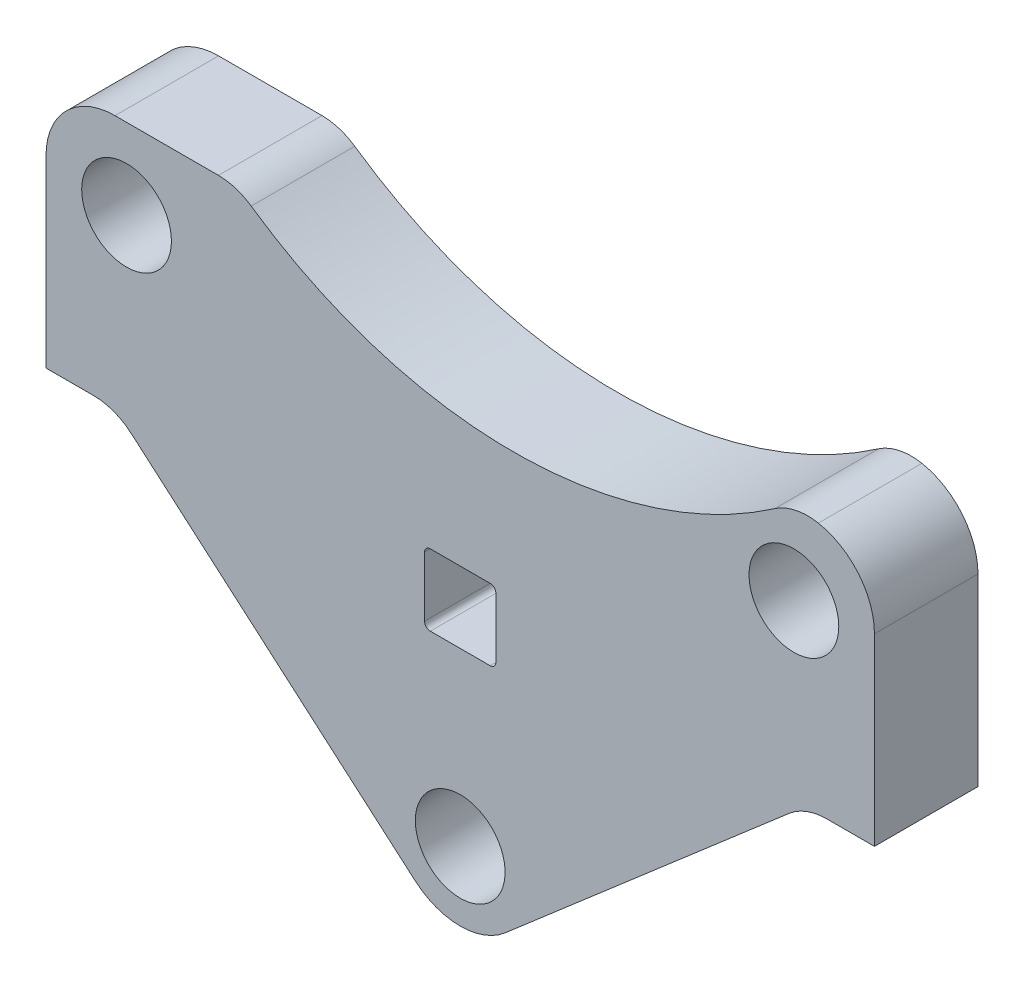
ISO-10303-21;
HEADER;
FILE_DESCRIPTION(('STEP AP214'),'2;1');
FILE_NAME('part.step','',(''),(''),'','','');
FILE_SCHEMA(('AUTOMOTIVE_DESIGN { 1 0 10303 214 1 1 1 1 }'));
ENDSEC;
DATA;
#1=APPLICATION_CONTEXT('core data for automotive mechanical design processes');
#2=APPLICATION_PROTOCOL_DEFINITION('international standard','automotive_design',2000,#1);
#3=PRODUCT_CONTEXT('',#1,'mechanical');
#4=PRODUCT('Part','Part','',(#3));
#5=PRODUCT_RELATED_PRODUCT_CATEGORY('part','',(#4));
#6=PRODUCT_DEFINITION_FORMATION('','',#4);
#7=PRODUCT_DEFINITION_CONTEXT('part definition',#1,'design');
#8=PRODUCT_DEFINITION('design','',#6,#7);
#9=PRODUCT_DEFINITION_SHAPE('','',#8);
#10=(LENGTH_UNIT() NAMED_UNIT(*) SI_UNIT(.MILLI.,.METRE.));
#11=(NAMED_UNIT(*) PLANE_ANGLE_UNIT() SI_UNIT($,.RADIAN.));
#12=(NAMED_UNIT(*) SI_UNIT($,.STERADIAN.) SOLID_ANGLE_UNIT());
#13=UNCERTAINTY_MEASURE_WITH_UNIT(LENGTH_MEASURE(1.E-05),#10,'distance_accuracy_value','');
#14=(GEOMETRIC_REPRESENTATION_CONTEXT(3) GLOBAL_UNCERTAINTY_ASSIGNED_CONTEXT((#13)) GLOBAL_UNIT_ASSIGNED_CONTEXT((#10,
#11,#12)) REPRESENTATION_CONTEXT('',''));
#15=CARTESIAN_POINT('',(0.,0.,0.));
#16=DIRECTION('',(0.,0.,1.));
#17=DIRECTION('',(1.,0.,0.));
#18=AXIS2_PLACEMENT_3D('',#15,#16,#17);
#19=CARTESIAN_POINT('',(29.,-17.,54.000025));
#20=DIRECTION('',(0.,0.,-1.));
#21=DIRECTION('',(-1.,0.,0.));
#22=AXIS2_PLACEMENT_3D('',#19,#20,#21);
#23=CYLINDRICAL_SURFACE('',#22,3.9);
#24=CARTESIAN_POINT('',(29.,-17.,14.));
#25=DIRECTION('',(0.,0.,1.));
#26=DIRECTION('',(1.,0.,0.));
#27=AXIS2_PLACEMENT_3D('',#24,#25,#26);
#28=CIRCLE('',#27,3.9);
#29=CARTESIAN_POINT('',(32.9,-17.,14.));
#30=VERTEX_POINT('',#29);
#31=EDGE_CURVE('E352',#30,#30,#28,.T.);
#32=ORIENTED_EDGE('',*,*,#31,.T.);
#33=EDGE_LOOP('',(#32));
#34=FACE_BOUND('',#33,.T.);
#35=CARTESIAN_POINT('',(29.,-17.,5.));
#36=DIRECTION('',(0.,0.,-1.));
#37=DIRECTION('',(-1.,0.,0.));
#38=AXIS2_PLACEMENT_3D('',#35,#36,#37);
#39=CIRCLE('',#38,3.9);
#40=CARTESIAN_POINT('',(25.1,-17.,5.));
#41=VERTEX_POINT('',#40);
#42=EDGE_CURVE('E349',#41,#41,#39,.T.);
#43=ORIENTED_EDGE('',*,*,#42,.T.);
#44=EDGE_LOOP('',(#43));
#45=FACE_BOUND('',#44,.T.);
#46=ADVANCED_FACE('F35',(#34,#45),#23,.F.);
#47=CARTESIAN_POINT('',(-29.,-17.,54.000025));
#48=DIRECTION('',(0.,0.,-1.));
#49=DIRECTION('',(-1.,0.,0.));
#50=AXIS2_PLACEMENT_3D('',#47,#48,#49);
#51=CYLINDRICAL_SURFACE('',#50,3.89999999999999);
#52=CARTESIAN_POINT('',(-29.,-17.,14.));
#53=DIRECTION('',(0.,0.,1.));
#54=DIRECTION('',(1.,0.,0.));
#55=AXIS2_PLACEMENT_3D('',#52,#53,#54);
#56=CIRCLE('',#55,3.89999999999999);
#57=CARTESIAN_POINT('',(-25.1,-17.,14.));
#58=VERTEX_POINT('',#57);
#59=EDGE_CURVE('E344',#58,#58,#56,.T.);
#60=ORIENTED_EDGE('',*,*,#59,.T.);
#61=EDGE_LOOP('',(#60));
#62=FACE_BOUND('',#61,.T.);
#63=CARTESIAN_POINT('',(-29.,-17.,5.));
#64=DIRECTION('',(0.,0.,-1.));
#65=DIRECTION('',(-1.,0.,0.));
#66=AXIS2_PLACEMENT_3D('',#63,#64,#65);
#67=CIRCLE('',#66,3.89999999999999);
#68=CARTESIAN_POINT('',(-32.9,-17.,5.));
#69=VERTEX_POINT('',#68);
#70=EDGE_CURVE('E341',#69,#69,#67,.T.);
#71=ORIENTED_EDGE('',*,*,#70,.T.);
#72=EDGE_LOOP('',(#71));
#73=FACE_BOUND('',#72,.T.);
#74=ADVANCED_FACE('F473',(#62,#73),#51,.F.);
#75=CARTESIAN_POINT('',(30.,-16.,14.));
#76=DIRECTION('',(0.,0.,-1.));
#77=DIRECTION('',(-1.,0.,0.));
#78=AXIS2_PLACEMENT_3D('',#75,#76,#77);
#79=CYLINDRICAL_SURFACE('',#78,6.);
#80=CARTESIAN_POINT('',(30.,-16.,5.));
#81=DIRECTION('',(0.,0.,-1.));
#82=DIRECTION('',(1.,0.,0.));
#83=AXIS2_PLACEMENT_3D('',#80,#81,#82);
#84=CIRCLE('',#83,6.);
#85=CARTESIAN_POINT('',(31.1219773338338,-10.1058362032971,5.));
#86=VERTEX_POINT('',#85);
#87=CARTESIAN_POINT('',(36.,-16.,5.));
#88=VERTEX_POINT('',#87);
#89=EDGE_CURVE('E198',#86,#88,#84,.T.);
#90=ORIENTED_EDGE('',*,*,#89,.F.);
#91=DIRECTION('',(0.,0.,-1.));
#92=VECTOR('',#91,1.);
#93=CARTESIAN_POINT('',(31.1219773338338,-10.1058362032971,14.));
#94=LINE('',#93,#92);
#95=CARTESIAN_POINT('',(31.1219773338338,-10.1058362032971,14.));
#96=VERTEX_POINT('',#95);
#97=EDGE_CURVE('E254',#86,#96,#94,.F.);
#98=ORIENTED_EDGE('',*,*,#97,.T.);
#99=CARTESIAN_POINT('',(30.,-16.,14.));
#100=DIRECTION('',(0.,0.,-1.));
#101=DIRECTION('',(1.,0.,0.));
#102=AXIS2_PLACEMENT_3D('',#99,#100,#101);
#103=CIRCLE('',#102,6.);
#104=CARTESIAN_POINT('',(36.,-16.,14.));
#105=VERTEX_POINT('',#104);
#106=EDGE_CURVE('E377',#96,#105,#103,.T.);
#107=ORIENTED_EDGE('',*,*,#106,.T.);
#108=DIRECTION('',(0.,0.,-1.));
#109=VECTOR('',#108,1.);
#110=CARTESIAN_POINT('',(36.,-16.,14.));
#111=LINE('',#110,#109);
#112=EDGE_CURVE('E386',#105,#88,#111,.T.);
#113=ORIENTED_EDGE('',*,*,#112,.T.);
#114=EDGE_LOOP('',(#90,#98,#107,#113));
#115=FACE_BOUND('',#114,.T.);
#116=ADVANCED_FACE('F425',(#115),#79,.T.);
#117=CARTESIAN_POINT('',(-30.,-16.,14.));
#118=DIRECTION('',(0.,0.,-1.));
#119=DIRECTION('',(-1.,0.,0.));
#120=AXIS2_PLACEMENT_3D('',#117,#118,#119);
#121=CYLINDRICAL_SURFACE('',#120,6.);
#122=CARTESIAN_POINT('',(-30.,-16.,5.));
#123=DIRECTION('',(0.,0.,-1.));
#124=DIRECTION('',(1.,0.,0.));
#125=AXIS2_PLACEMENT_3D('',#122,#123,#124);
#126=CIRCLE('',#125,6.);
#127=CARTESIAN_POINT('',(-36.,-16.,5.));
#128=VERTEX_POINT('',#127);
#129=CARTESIAN_POINT('',(-30.,-10.,5.));
#130=VERTEX_POINT('',#129);
#131=EDGE_CURVE('E202',#128,#130,#126,.T.);
#132=ORIENTED_EDGE('',*,*,#131,.F.);
#133=DIRECTION('',(0.,0.,-1.));
#134=VECTOR('',#133,1.);
#135=CARTESIAN_POINT('',(-36.,-16.,14.));
#136=LINE('',#135,#134);
#137=CARTESIAN_POINT('',(-36.,-16.,14.));
#138=VERTEX_POINT('',#137);
#139=EDGE_CURVE('E379',#138,#128,#136,.T.);
#140=ORIENTED_EDGE('',*,*,#139,.F.);
#141=CARTESIAN_POINT('',(-30.,-16.,14.));
#142=DIRECTION('',(0.,0.,-1.));
#143=DIRECTION('',(1.,0.,0.));
#144=AXIS2_PLACEMENT_3D('',#141,#142,#143);
#145=CIRCLE('',#144,6.);
#146=CARTESIAN_POINT('',(-30.,-10.,14.));
#147=VERTEX_POINT('',#146);
#148=EDGE_CURVE('E370',#138,#147,#145,.T.);
#149=ORIENTED_EDGE('',*,*,#148,.T.);
#150=DIRECTION('',(0.,0.,-1.));
#151=VECTOR('',#150,1.);
#152=CARTESIAN_POINT('',(-30.,-10.,14.));
#153=LINE('',#152,#151);
#154=EDGE_CURVE('E389',#147,#130,#153,.T.);
#155=ORIENTED_EDGE('',*,*,#154,.T.);
#156=EDGE_LOOP('',(#132,#140,#149,#155));
#157=FACE_BOUND('',#156,.T.);
#158=ADVANCED_FACE('F404',(#157),#121,.T.);
#159=CARTESIAN_POINT('',(30.,-10.,14.));
#160=DIRECTION('',(0.,1.,0.));
#161=DIRECTION('',(0.,0.,1.));
#162=AXIS2_PLACEMENT_3D('',#159,#160,#161);
#163=PLANE('',#162);
#164=DIRECTION('',(1.,0.,0.));
#165=VECTOR('',#164,1.);
#166=CARTESIAN_POINT('',(30.,-10.,14.));
#167=LINE('',#166,#165);
#168=CARTESIAN_POINT('',(-21.0124969497011,-10.,14.));
#169=VERTEX_POINT('',#168);
#170=EDGE_CURVE('E373',#147,#169,#167,.T.);
#171=ORIENTED_EDGE('',*,*,#170,.T.);
#172=DIRECTION('',(0.,0.,1.));
#173=VECTOR('',#172,1.);
#174=CARTESIAN_POINT('',(-21.0124969497011,-10.,5.));
#175=LINE('',#174,#173);
#176=CARTESIAN_POINT('',(-21.0124969497011,-10.,5.));
#177=VERTEX_POINT('',#176);
#178=EDGE_CURVE('E260',#169,#177,#175,.F.);
#179=ORIENTED_EDGE('',*,*,#178,.T.);
#180=DIRECTION('',(1.,0.,0.));
#181=VECTOR('',#180,1.);
#182=CARTESIAN_POINT('',(30.,-10.,5.));
#183=LINE('',#182,#181);
#184=EDGE_CURVE('E382',#130,#177,#183,.T.);
#185=ORIENTED_EDGE('',*,*,#184,.F.);
#186=ORIENTED_EDGE('',*,*,#154,.F.);
#187=EDGE_LOOP('',(#171,#179,#185,#186));
#188=FACE_BOUND('',#187,.T.);
#189=ADVANCED_FACE('F408',(#188),#163,.T.);
#190=CARTESIAN_POINT('',(4.60000000003025,22.,54.000025));
#191=DIRECTION('',(0.,0.,-1.));
#192=DIRECTION('',(-1.,0.,0.));
#193=AXIS2_PLACEMENT_3D('',#190,#191,#192);
#194=CYLINDRICAL_SURFACE('',#193,40.);
#195=CARTESIAN_POINT('',(4.60000000003025,22.,14.));
#196=DIRECTION('',(0.,0.,1.));
#197=DIRECTION('',(1.,0.,0.));
#198=AXIS2_PLACEMENT_3D('',#195,#196,#197);
#199=CIRCLE('',#198,40.);
#200=CARTESIAN_POINT('',(-18.1666639552865,-10.8888888888889,14.));
#201=VERTEX_POINT('',#200);
#202=CARTESIAN_POINT('',(27.3439966420528,-10.9045683264143,14.));
#203=VERTEX_POINT('',#202);
#204=EDGE_CURVE('E220',#201,#203,#199,.T.);
#205=ORIENTED_EDGE('',*,*,#204,.T.);
#206=DIRECTION('',(0.,0.,-1.));
#207=VECTOR('',#206,1.);
#208=CARTESIAN_POINT('',(27.3439966420528,-10.9045683264143,54.000025));
#209=LINE('',#208,#207);
#210=CARTESIAN_POINT('',(27.3439966420528,-10.9045683264143,5.));
#211=VERTEX_POINT('',#210);
#212=EDGE_CURVE('E247',#203,#211,#209,.T.);
#213=ORIENTED_EDGE('',*,*,#212,.T.);
#214=CARTESIAN_POINT('',(4.60000000003025,22.,5.));
#215=DIRECTION('',(0.,0.,-1.));
#216=DIRECTION('',(-1.,0.,0.));
#217=AXIS2_PLACEMENT_3D('',#214,#215,#216);
#218=CIRCLE('',#217,40.);
#219=CARTESIAN_POINT('',(-18.1666639552865,-10.8888888888889,5.));
#220=VERTEX_POINT('',#219);
#221=EDGE_CURVE('E338',#211,#220,#218,.T.);
#222=ORIENTED_EDGE('',*,*,#221,.T.);
#223=DIRECTION('',(0.,0.,-1.));
#224=VECTOR('',#223,1.);
#225=CARTESIAN_POINT('',(-18.1666639552865,-10.8888888888889,54.000025));
#226=LINE('',#225,#224);
#227=EDGE_CURVE('E244',#220,#201,#226,.F.);
#228=ORIENTED_EDGE('',*,*,#227,.T.);
#229=EDGE_LOOP('',(#205,#213,#222,#228));
#230=FACE_BOUND('',#229,.T.);
#231=ADVANCED_FACE('F416',(#230),#194,.F.);
#232=CARTESIAN_POINT('',(0.,-50.,14.));
#233=DIRECTION('',(0.,0.,-1.));
#234=DIRECTION('',(-1.,0.,0.));
#235=AXIS2_PLACEMENT_3D('',#232,#233,#234);
#236=CYLINDRICAL_SURFACE('',#235,6.);
#237=CARTESIAN_POINT('',(0.,-50.,5.));
#238=DIRECTION('',(0.,0.,-1.));
#239=DIRECTION('',(-1.,0.,0.));
#240=AXIS2_PLACEMENT_3D('',#237,#238,#239);
#241=CIRCLE('',#240,6.);
#242=CARTESIAN_POINT('',(3.92359198934366,-54.5393199822394,5.));
#243=VERTEX_POINT('',#242);
#244=CARTESIAN_POINT('',(-3.92359198934366,-54.5393199822394,5.));
#245=VERTEX_POINT('',#244);
#246=EDGE_CURVE('E363',#243,#245,#241,.T.);
#247=ORIENTED_EDGE('',*,*,#246,.F.);
#248=DIRECTION('',(0.,0.,-1.));
#249=VECTOR('',#248,1.);
#250=CARTESIAN_POINT('',(3.92359198934366,-54.5393199822394,14.));
#251=LINE('',#250,#249);
#252=CARTESIAN_POINT('',(3.92359198934366,-54.5393199822394,14.));
#253=VERTEX_POINT('',#252);
#254=EDGE_CURVE('E362',#253,#243,#251,.T.);
#255=ORIENTED_EDGE('',*,*,#254,.F.);
#256=CARTESIAN_POINT('',(0.,-50.,14.));
#257=DIRECTION('',(0.,0.,-1.));
#258=DIRECTION('',(-1.,0.,0.));
#259=AXIS2_PLACEMENT_3D('',#256,#257,#258);
#260=CIRCLE('',#259,6.);
#261=CARTESIAN_POINT('',(-3.92359198934366,-54.5393199822394,14.));
#262=VERTEX_POINT('',#261);
#263=EDGE_CURVE('E355',#253,#262,#260,.T.);
#264=ORIENTED_EDGE('',*,*,#263,.T.);
#265=DIRECTION('',(0.,0.,-1.));
#266=VECTOR('',#265,1.);
#267=CARTESIAN_POINT('',(-3.92359198934366,-54.5393199822394,14.));
#268=LINE('',#267,#266);
#269=EDGE_CURVE('E203',#262,#245,#268,.T.);
#270=ORIENTED_EDGE('',*,*,#269,.T.);
#271=EDGE_LOOP('',(#247,#255,#264,#270));
#272=FACE_BOUND('',#271,.T.);
#273=ADVANCED_FACE('F454',(#272),#236,.T.);
#274=CARTESIAN_POINT('',(-30.,-32.,14.));
#275=DIRECTION('',(-0.653931998223944,-0.756553330373239,0.));
#276=DIRECTION('',(0.75655333037324,-0.653931998223944,0.));
#277=AXIS2_PLACEMENT_3D('',#274,#275,#276);
#278=PLANE('',#277);
#279=DIRECTION('',(-0.756553330373239,0.653931998223944,0.));
#280=VECTOR('',#279,1.);
#281=CARTESIAN_POINT('',(-30.,-32.,14.));
#282=LINE('',#281,#280);
#283=CARTESIAN_POINT('',(-28.5917466252254,-33.2172333481338,14.));
#284=VERTEX_POINT('',#283);
#285=EDGE_CURVE('E359',#262,#284,#282,.T.);
#286=ORIENTED_EDGE('',*,*,#285,.T.);
#287=DIRECTION('',(0.,0.,-1.));
#288=VECTOR('',#287,1.);
#289=CARTESIAN_POINT('',(-28.5917466252254,-33.2172333481338,14.));
#290=LINE('',#289,#288);
#291=CARTESIAN_POINT('',(-28.5917466252254,-33.2172333481338,5.));
#292=VERTEX_POINT('',#291);
#293=EDGE_CURVE('E240',#284,#292,#290,.T.);
#294=ORIENTED_EDGE('',*,*,#293,.T.);
#295=DIRECTION('',(-0.756553330373239,0.653931998223944,0.));
#296=VECTOR('',#295,1.);
#297=CARTESIAN_POINT('',(-30.,-32.,5.));
#298=LINE('',#297,#296);
#299=EDGE_CURVE('E356',#245,#292,#298,.T.);
#300=ORIENTED_EDGE('',*,*,#299,.F.);
#301=ORIENTED_EDGE('',*,*,#269,.F.);
#302=EDGE_LOOP('',(#286,#294,#300,#301));
#303=FACE_BOUND('',#302,.T.);
#304=ADVANCED_FACE('F447',(#303),#278,.T.);
#305=CARTESIAN_POINT('',(30.,-32.,14.));
#306=DIRECTION('',(0.653931998223944,-0.756553330373239,0.));
#307=DIRECTION('',(0.75655333037324,0.653931998223944,0.));
#308=AXIS2_PLACEMENT_3D('',#305,#306,#307);
#309=PLANE('',#308);
#310=DIRECTION('',(-0.756553330373239,-0.653931998223944,0.));
#311=VECTOR('',#310,1.);
#312=CARTESIAN_POINT('',(30.,-32.,5.));
#313=LINE('',#312,#311);
#314=CARTESIAN_POINT('',(28.5917466252254,-33.2172333481338,5.));
#315=VERTEX_POINT('',#314);
#316=EDGE_CURVE('E366',#315,#243,#313,.T.);
#317=ORIENTED_EDGE('',*,*,#316,.F.);
#318=DIRECTION('',(0.,0.,-1.));
#319=VECTOR('',#318,1.);
#320=CARTESIAN_POINT('',(28.5917466252254,-33.2172333481338,14.));
#321=LINE('',#320,#319);
#322=CARTESIAN_POINT('',(28.5917466252254,-33.2172333481338,14.));
#323=VERTEX_POINT('',#322);
#324=EDGE_CURVE('E437',#315,#323,#321,.F.);
#325=ORIENTED_EDGE('',*,*,#324,.T.);
#326=DIRECTION('',(-0.756553330373239,-0.653931998223944,0.));
#327=VECTOR('',#326,1.);
#328=CARTESIAN_POINT('',(30.,-32.,14.));
#329=LINE('',#328,#327);
#330=EDGE_CURVE('E353',#323,#253,#329,.T.);
#331=ORIENTED_EDGE('',*,*,#330,.T.);
#332=ORIENTED_EDGE('',*,*,#254,.T.);
#333=EDGE_LOOP('',(#317,#325,#331,#332));
#334=FACE_BOUND('',#333,.T.);
#335=ADVANCED_FACE('F486',(#334),#309,.T.);
#336=CARTESIAN_POINT('',(30.,-16.,14.));
#337=DIRECTION('',(0.,0.,1.));
#338=DIRECTION('',(1.,0.,0.));
#339=AXIS2_PLACEMENT_3D('',#336,#337,#338);
#340=PLANE('',#339);
#341=DIRECTION('',(-1.,0.,0.));
#342=VECTOR('',#341,1.);
#343=CARTESIAN_POINT('',(3.1,-35.1,14.));
#344=LINE('',#343,#342);
#345=CARTESIAN_POINT('',(2.6,-35.1,14.));
#346=VERTEX_POINT('',#345);
#347=CARTESIAN_POINT('',(-2.6,-35.1,14.));
#348=VERTEX_POINT('',#347);
#349=EDGE_CURVE('E323',#346,#348,#344,.T.);
#350=ORIENTED_EDGE('',*,*,#349,.T.);
#351=CARTESIAN_POINT('',(-2.6,-34.6,14.));
#352=DIRECTION('',(0.,0.,1.));
#353=DIRECTION('',(1.,0.,0.));
#354=AXIS2_PLACEMENT_3D('',#351,#352,#353);
#355=CIRCLE('',#354,0.5);
#356=CARTESIAN_POINT('',(-3.1,-34.6,14.));
#357=VERTEX_POINT('',#356);
#358=EDGE_CURVE('E295',#348,#357,#355,.F.);
#359=ORIENTED_EDGE('',*,*,#358,.T.);
#360=DIRECTION('',(0.,1.,0.));
#361=VECTOR('',#360,1.);
#362=CARTESIAN_POINT('',(-3.1,-35.1,14.));
#363=LINE('',#362,#361);
#364=CARTESIAN_POINT('',(-3.1,-29.4,14.));
#365=VERTEX_POINT('',#364);
#366=EDGE_CURVE('E325',#357,#365,#363,.T.);
#367=ORIENTED_EDGE('',*,*,#366,.T.);
#368=CARTESIAN_POINT('',(-2.6,-29.4,14.));
#369=DIRECTION('',(0.,0.,1.));
#370=DIRECTION('',(1.,0.,0.));
#371=AXIS2_PLACEMENT_3D('',#368,#369,#370);
#372=CIRCLE('',#371,0.5);
#373=CARTESIAN_POINT('',(-2.6,-28.9,14.));
#374=VERTEX_POINT('',#373);
#375=EDGE_CURVE('E57',#365,#374,#372,.F.);
#376=ORIENTED_EDGE('',*,*,#375,.T.);
#377=DIRECTION('',(1.,0.,0.));
#378=VECTOR('',#377,1.);
#379=CARTESIAN_POINT('',(3.1,-28.9,14.));
#380=LINE('',#379,#378);
#381=CARTESIAN_POINT('',(2.6,-28.9,14.));
#382=VERTEX_POINT('',#381);
#383=EDGE_CURVE('E214',#374,#382,#380,.T.);
#384=ORIENTED_EDGE('',*,*,#383,.T.);
#385=CARTESIAN_POINT('',(2.6,-29.4,14.));
#386=DIRECTION('',(0.,0.,1.));
#387=DIRECTION('',(1.,0.,0.));
#388=AXIS2_PLACEMENT_3D('',#385,#386,#387);
#389=CIRCLE('',#388,0.5);
#390=CARTESIAN_POINT('',(3.1,-29.4,14.));
#391=VERTEX_POINT('',#390);
#392=EDGE_CURVE('E11',#382,#391,#389,.F.);
#393=ORIENTED_EDGE('',*,*,#392,.T.);
#394=DIRECTION('',(0.,-1.,0.));
#395=VECTOR('',#394,1.);
#396=CARTESIAN_POINT('',(3.1,-35.1,14.));
#397=LINE('',#396,#395);
#398=CARTESIAN_POINT('',(3.1,-34.6,14.));
#399=VERTEX_POINT('',#398);
#400=EDGE_CURVE('E318',#391,#399,#397,.T.);
#401=ORIENTED_EDGE('',*,*,#400,.T.);
#402=CARTESIAN_POINT('',(2.6,-34.6,14.));
#403=DIRECTION('',(0.,0.,1.));
#404=DIRECTION('',(1.,0.,0.));
#405=AXIS2_PLACEMENT_3D('',#402,#403,#404);
#406=CIRCLE('',#405,0.5);
#407=EDGE_CURVE('E291',#399,#346,#406,.F.);
#408=ORIENTED_EDGE('',*,*,#407,.T.);
#409=EDGE_LOOP('',(#350,#359,#367,#376,#384,#393,#401,#408));
#410=FACE_BOUND('',#409,.T.);
#411=ORIENTED_EDGE('',*,*,#106,.F.);
#412=CARTESIAN_POINT('',(30.1869962223057,-15.0176393672161,14.));
#413=DIRECTION('',(0.,0.,1.));
#414=DIRECTION('',(1.,0.,0.));
#415=AXIS2_PLACEMENT_3D('',#412,#413,#414);
#416=CIRCLE('',#415,5.);
#417=EDGE_CURVE('E258',#96,#203,#416,.T.);
#418=ORIENTED_EDGE('',*,*,#417,.T.);
#419=ORIENTED_EDGE('',*,*,#204,.F.);
#420=CARTESIAN_POINT('',(-21.0124969497011,-15.,14.));
#421=DIRECTION('',(0.,0.,1.));
#422=DIRECTION('',(1.,0.,0.));
#423=AXIS2_PLACEMENT_3D('',#420,#421,#422);
#424=CIRCLE('',#423,5.);
#425=EDGE_CURVE('E256',#201,#169,#424,.T.);
#426=ORIENTED_EDGE('',*,*,#425,.T.);
#427=ORIENTED_EDGE('',*,*,#170,.F.);
#428=ORIENTED_EDGE('',*,*,#148,.F.);
#429=DIRECTION('',(0.,1.,0.));
#430=VECTOR('',#429,1.);
#431=CARTESIAN_POINT('',(-36.,-22.,14.));
#432=LINE('',#431,#430);
#433=CARTESIAN_POINT('',(-36.,-32.,14.));
#434=VERTEX_POINT('',#433);
#435=EDGE_CURVE('E374',#434,#138,#432,.T.);
#436=ORIENTED_EDGE('',*,*,#435,.F.);
#437=DIRECTION('',(-1.,0.,0.));
#438=VECTOR('',#437,1.);
#439=CARTESIAN_POINT('',(36.,-32.,14.));
#440=LINE('',#439,#438);
#441=CARTESIAN_POINT('',(-31.8614066163451,-32.,14.));
#442=VERTEX_POINT('',#441);
#443=EDGE_CURVE('E213',#442,#434,#440,.T.);
#444=ORIENTED_EDGE('',*,*,#443,.F.);
#445=CARTESIAN_POINT('',(-31.8614066163451,-37.,14.));
#446=DIRECTION('',(0.,0.,1.));
#447=DIRECTION('',(1.,0.,0.));
#448=AXIS2_PLACEMENT_3D('',#445,#446,#447);
#449=CIRCLE('',#448,5.);
#450=EDGE_CURVE('E268',#442,#284,#449,.F.);
#451=ORIENTED_EDGE('',*,*,#450,.T.);
#452=ORIENTED_EDGE('',*,*,#285,.F.);
#453=ORIENTED_EDGE('',*,*,#263,.F.);
#454=ORIENTED_EDGE('',*,*,#330,.F.);
#455=CARTESIAN_POINT('',(31.8614066163451,-37.,14.));
#456=DIRECTION('',(0.,0.,1.));
#457=DIRECTION('',(1.,0.,0.));
#458=AXIS2_PLACEMENT_3D('',#455,#456,#457);
#459=CIRCLE('',#458,5.);
#460=CARTESIAN_POINT('',(31.8614066163451,-32.,14.));
#461=VERTEX_POINT('',#460);
#462=EDGE_CURVE('E264',#323,#461,#459,.F.);
#463=ORIENTED_EDGE('',*,*,#462,.T.);
#464=CARTESIAN_POINT('',(36.,-32.,14.));
#465=VERTEX_POINT('',#464);
#466=EDGE_CURVE('E336',#465,#461,#440,.T.);
#467=ORIENTED_EDGE('',*,*,#466,.F.);
#468=DIRECTION('',(0.,-1.,0.));
#469=VECTOR('',#468,1.);
#470=CARTESIAN_POINT('',(36.,-22.,14.));
#471=LINE('',#470,#469);
#472=EDGE_CURVE('E209',#105,#465,#471,.T.);
#473=ORIENTED_EDGE('',*,*,#472,.F.);
#474=EDGE_LOOP('',(#411,#418,#419,#426,#427,#428,#436,#444,#451,#452,#453,#454,#463,#467,#473));
#475=FACE_BOUND('',#474,.T.);
#476=ORIENTED_EDGE('',*,*,#59,.F.);
#477=EDGE_LOOP('',(#476));
#478=FACE_BOUND('',#477,.T.);
#479=ORIENTED_EDGE('',*,*,#31,.F.);
#480=EDGE_LOOP('',(#479));
#481=FACE_BOUND('',#480,.T.);
#482=CARTESIAN_POINT('',(0.,-50.,14.));
#483=DIRECTION('',(0.,0.,-1.));
#484=DIRECTION('',(-1.,0.,0.));
#485=AXIS2_PLACEMENT_3D('',#482,#483,#484);
#486=CIRCLE('',#485,3.9);
#487=CARTESIAN_POINT('',(-3.9,-50.,14.));
#488=VERTEX_POINT('',#487);
#489=EDGE_CURVE('E348',#488,#488,#486,.T.);
#490=ORIENTED_EDGE('',*,*,#489,.T.);
#491=EDGE_LOOP('',(#490));
#492=FACE_BOUND('',#491,.T.);
#493=ADVANCED_FACE('F316',(#410,#475,#478,#481,#492),#340,.T.);
#494=CARTESIAN_POINT('',(36.,-22.,14.));
#495=DIRECTION('',(1.,0.,0.));
#496=DIRECTION('',(0.,0.,-1.));
#497=AXIS2_PLACEMENT_3D('',#494,#495,#496);
#498=PLANE('',#497);
#499=ORIENTED_EDGE('',*,*,#472,.T.);
#500=DIRECTION('',(0.,0.,1.));
#501=VECTOR('',#500,1.);
#502=CARTESIAN_POINT('',(36.,-32.,14.));
#503=LINE('',#502,#501);
#504=CARTESIAN_POINT('',(36.,-32.,5.));
#505=VERTEX_POINT('',#504);
#506=EDGE_CURVE('E206',#505,#465,#503,.T.);
#507=ORIENTED_EDGE('',*,*,#506,.F.);
#508=DIRECTION('',(0.,-1.,0.));
#509=VECTOR('',#508,1.);
#510=CARTESIAN_POINT('',(36.,-22.,5.));
#511=LINE('',#510,#509);
#512=EDGE_CURVE('E191',#88,#505,#511,.T.);
#513=ORIENTED_EDGE('',*,*,#512,.F.);
#514=ORIENTED_EDGE('',*,*,#112,.F.);
#515=EDGE_LOOP('',(#499,#507,#513,#514));
#516=FACE_BOUND('',#515,.T.);
#517=ADVANCED_FACE('F207',(#516),#498,.T.);
#518=CARTESIAN_POINT('',(-36.,-51.,5.));
#519=DIRECTION('',(0.,0.,1.));
#520=DIRECTION('',(1.,0.,0.));
#521=AXIS2_PLACEMENT_3D('',#518,#519,#520);
#522=PLANE('',#521);
#523=DIRECTION('',(1.,0.,0.));
#524=VECTOR('',#523,1.);
#525=CARTESIAN_POINT('',(3.1,-28.9,5.));
#526=LINE('',#525,#524);
#527=CARTESIAN_POINT('',(-2.6,-28.9,5.));
#528=VERTEX_POINT('',#527);
#529=CARTESIAN_POINT('',(2.6,-28.9,5.));
#530=VERTEX_POINT('',#529);
#531=EDGE_CURVE('E303',#528,#530,#526,.T.);
#532=ORIENTED_EDGE('',*,*,#531,.F.);
#533=CARTESIAN_POINT('',(-2.6,-29.4,5.));
#534=DIRECTION('',(0.,0.,1.));
#535=DIRECTION('',(1.,0.,0.));
#536=AXIS2_PLACEMENT_3D('',#533,#534,#535);
#537=CIRCLE('',#536,0.5);
#538=CARTESIAN_POINT('',(-3.1,-29.4,5.));
#539=VERTEX_POINT('',#538);
#540=EDGE_CURVE('E297',#528,#539,#537,.T.);
#541=ORIENTED_EDGE('',*,*,#540,.T.);
#542=DIRECTION('',(0.,1.,0.));
#543=VECTOR('',#542,1.);
#544=CARTESIAN_POINT('',(-3.1,-35.1,5.));
#545=LINE('',#544,#543);
#546=CARTESIAN_POINT('',(-3.1,-34.6,5.));
#547=VERTEX_POINT('',#546);
#548=EDGE_CURVE('E310',#547,#539,#545,.T.);
#549=ORIENTED_EDGE('',*,*,#548,.F.);
#550=CARTESIAN_POINT('',(-2.6,-34.6,5.));
#551=DIRECTION('',(0.,0.,1.));
#552=DIRECTION('',(1.,0.,0.));
#553=AXIS2_PLACEMENT_3D('',#550,#551,#552);
#554=CIRCLE('',#553,0.5);
#555=CARTESIAN_POINT('',(-2.6,-35.1,5.));
#556=VERTEX_POINT('',#555);
#557=EDGE_CURVE('E293',#547,#556,#554,.T.);
#558=ORIENTED_EDGE('',*,*,#557,.T.);
#559=DIRECTION('',(-1.,0.,0.));
#560=VECTOR('',#559,1.);
#561=CARTESIAN_POINT('',(3.1,-35.1,5.));
#562=LINE('',#561,#560);
#563=CARTESIAN_POINT('',(2.6,-35.1,5.));
#564=VERTEX_POINT('',#563);
#565=EDGE_CURVE('E332',#564,#556,#562,.T.);
#566=ORIENTED_EDGE('',*,*,#565,.F.);
#567=CARTESIAN_POINT('',(2.6,-34.6,5.));
#568=DIRECTION('',(0.,0.,1.));
#569=DIRECTION('',(1.,0.,0.));
#570=AXIS2_PLACEMENT_3D('',#567,#568,#569);
#571=CIRCLE('',#570,0.5);
#572=CARTESIAN_POINT('',(3.1,-34.6,5.));
#573=VERTEX_POINT('',#572);
#574=EDGE_CURVE('E289',#564,#573,#571,.T.);
#575=ORIENTED_EDGE('',*,*,#574,.T.);
#576=DIRECTION('',(0.,-1.,0.));
#577=VECTOR('',#576,1.);
#578=CARTESIAN_POINT('',(3.1,-35.1,5.));
#579=LINE('',#578,#577);
#580=CARTESIAN_POINT('',(3.1,-29.4,5.));
#581=VERTEX_POINT('',#580);
#582=EDGE_CURVE('E305',#581,#573,#579,.T.);
#583=ORIENTED_EDGE('',*,*,#582,.F.);
#584=CARTESIAN_POINT('',(2.6,-29.4,5.));
#585=DIRECTION('',(0.,0.,1.));
#586=DIRECTION('',(1.,0.,0.));
#587=AXIS2_PLACEMENT_3D('',#584,#585,#586);
#588=CIRCLE('',#587,0.5);
#589=EDGE_CURVE('E43',#581,#530,#588,.T.);
#590=ORIENTED_EDGE('',*,*,#589,.T.);
#591=EDGE_LOOP('',(#532,#541,#549,#558,#566,#575,#583,#590));
#592=FACE_BOUND('',#591,.T.);
#593=ORIENTED_EDGE('',*,*,#70,.F.);
#594=EDGE_LOOP('',(#593));
#595=FACE_BOUND('',#594,.T.);
#596=CARTESIAN_POINT('',(0.,-50.,5.));
#597=DIRECTION('',(0.,0.,-1.));
#598=DIRECTION('',(-1.,0.,0.));
#599=AXIS2_PLACEMENT_3D('',#596,#597,#598);
#600=CIRCLE('',#599,3.9);
#601=CARTESIAN_POINT('',(-3.9,-50.,5.));
#602=VERTEX_POINT('',#601);
#603=EDGE_CURVE('E345',#602,#602,#600,.T.);
#604=ORIENTED_EDGE('',*,*,#603,.F.);
#605=EDGE_LOOP('',(#604));
#606=FACE_BOUND('',#605,.T.);
#607=ORIENTED_EDGE('',*,*,#42,.F.);
#608=EDGE_LOOP('',(#607));
#609=FACE_BOUND('',#608,.T.);
#610=ORIENTED_EDGE('',*,*,#221,.F.);
#611=CARTESIAN_POINT('',(30.1869962223057,-15.0176393672161,5.));
#612=DIRECTION('',(0.,0.,1.));
#613=DIRECTION('',(1.,0.,0.));
#614=AXIS2_PLACEMENT_3D('',#611,#612,#613);
#615=CIRCLE('',#614,5.);
#616=EDGE_CURVE('E252',#211,#86,#615,.F.);
#617=ORIENTED_EDGE('',*,*,#616,.T.);
#618=ORIENTED_EDGE('',*,*,#89,.T.);
#619=ORIENTED_EDGE('',*,*,#512,.T.);
#620=DIRECTION('',(-1.,0.,0.));
#621=VECTOR('',#620,1.);
#622=CARTESIAN_POINT('',(-19.9999999999999,-32.,5.));
#623=LINE('',#622,#621);
#624=CARTESIAN_POINT('',(31.8614066163451,-32.,5.));
#625=VERTEX_POINT('',#624);
#626=EDGE_CURVE('E196',#505,#625,#623,.T.);
#627=ORIENTED_EDGE('',*,*,#626,.T.);
#628=CARTESIAN_POINT('',(31.8614066163451,-37.,5.));
#629=DIRECTION('',(0.,0.,1.));
#630=DIRECTION('',(1.,0.,0.));
#631=AXIS2_PLACEMENT_3D('',#628,#629,#630);
#632=CIRCLE('',#631,5.);
#633=EDGE_CURVE('E262',#625,#315,#632,.T.);
#634=ORIENTED_EDGE('',*,*,#633,.T.);
#635=ORIENTED_EDGE('',*,*,#316,.T.);
#636=ORIENTED_EDGE('',*,*,#246,.T.);
#637=ORIENTED_EDGE('',*,*,#299,.T.);
#638=CARTESIAN_POINT('',(-31.8614066163451,-37.,5.));
#639=DIRECTION('',(0.,0.,1.));
#640=DIRECTION('',(1.,0.,0.));
#641=AXIS2_PLACEMENT_3D('',#638,#639,#640);
#642=CIRCLE('',#641,5.);
#643=CARTESIAN_POINT('',(-31.8614066163451,-32.,5.));
#644=VERTEX_POINT('',#643);
#645=EDGE_CURVE('E266',#292,#644,#642,.T.);
#646=ORIENTED_EDGE('',*,*,#645,.T.);
#647=CARTESIAN_POINT('',(-36.,-32.,5.));
#648=VERTEX_POINT('',#647);
#649=EDGE_CURVE('E221',#644,#648,#623,.T.);
#650=ORIENTED_EDGE('',*,*,#649,.T.);
#651=DIRECTION('',(0.,1.,0.));
#652=VECTOR('',#651,1.);
#653=CARTESIAN_POINT('',(-36.,51.,5.));
#654=LINE('',#653,#652);
#655=EDGE_CURVE('E225',#648,#128,#654,.T.);
#656=ORIENTED_EDGE('',*,*,#655,.T.);
#657=ORIENTED_EDGE('',*,*,#131,.T.);
#658=ORIENTED_EDGE('',*,*,#184,.T.);
#659=CARTESIAN_POINT('',(-21.0124969497011,-15.,5.));
#660=DIRECTION('',(0.,0.,1.));
#661=DIRECTION('',(1.,0.,0.));
#662=AXIS2_PLACEMENT_3D('',#659,#660,#661);
#663=CIRCLE('',#662,5.);
#664=EDGE_CURVE('E250',#177,#220,#663,.F.);
#665=ORIENTED_EDGE('',*,*,#664,.T.);
#666=EDGE_LOOP('',(#610,#617,#618,#619,#627,#634,#635,#636,#637,#646,#650,#656,#657,#658,#665));
#667=FACE_BOUND('',#666,.T.);
#668=ADVANCED_FACE('F194',(#592,#595,#606,#609,#667),#522,.F.);
#669=CARTESIAN_POINT('',(-36.,51.,5.));
#670=DIRECTION('',(1.,0.,0.));
#671=DIRECTION('',(0.,1.,0.));
#672=AXIS2_PLACEMENT_3D('',#669,#670,#671);
#673=PLANE('',#672);
#674=DIRECTION('',(0.,0.,-1.));
#675=VECTOR('',#674,1.);
#676=CARTESIAN_POINT('',(-36.,-32.,4.99999999999999));
#677=LINE('',#676,#675);
#678=EDGE_CURVE('E388',#434,#648,#677,.T.);
#679=ORIENTED_EDGE('',*,*,#678,.F.);
#680=ORIENTED_EDGE('',*,*,#435,.T.);
#681=ORIENTED_EDGE('',*,*,#139,.T.);
#682=ORIENTED_EDGE('',*,*,#655,.F.);
#683=EDGE_LOOP('',(#679,#680,#681,#682));
#684=FACE_BOUND('',#683,.T.);
#685=ADVANCED_FACE('F400',(#684),#673,.F.);
#686=CARTESIAN_POINT('',(20.,-32.,15.));
#687=DIRECTION('',(0.,1.,0.));
#688=DIRECTION('',(-1.,0.,0.));
#689=AXIS2_PLACEMENT_3D('',#686,#687,#688);
#690=PLANE('',#689);
#691=ORIENTED_EDGE('',*,*,#466,.T.);
#692=DIRECTION('',(0.,0.,-1.));
#693=VECTOR('',#692,1.);
#694=CARTESIAN_POINT('',(31.8614066163451,-32.,15.));
#695=LINE('',#694,#693);
#696=EDGE_CURVE('E219',#461,#625,#695,.T.);
#697=ORIENTED_EDGE('',*,*,#696,.T.);
#698=ORIENTED_EDGE('',*,*,#626,.F.);
#699=ORIENTED_EDGE('',*,*,#506,.T.);
#700=EDGE_LOOP('',(#691,#697,#698,#699));
#701=FACE_BOUND('',#700,.T.);
#702=ADVANCED_FACE('F217',(#701),#690,.F.);
#703=ORIENTED_EDGE('',*,*,#649,.F.);
#704=DIRECTION('',(0.,0.,-1.));
#705=VECTOR('',#704,1.);
#706=CARTESIAN_POINT('',(-31.8614066163451,-32.,15.));
#707=LINE('',#706,#705);
#708=EDGE_CURVE('E242',#644,#442,#707,.F.);
#709=ORIENTED_EDGE('',*,*,#708,.T.);
#710=ORIENTED_EDGE('',*,*,#443,.T.);
#711=ORIENTED_EDGE('',*,*,#678,.T.);
#712=EDGE_LOOP('',(#703,#709,#710,#711));
#713=FACE_BOUND('',#712,.T.);
#714=ADVANCED_FACE('F459',(#713),#690,.F.);
#715=CARTESIAN_POINT('',(0.,-50.,54.000025));
#716=DIRECTION('',(0.,0.,-1.));
#717=DIRECTION('',(-1.,0.,0.));
#718=AXIS2_PLACEMENT_3D('',#715,#716,#717);
#719=CYLINDRICAL_SURFACE('',#718,3.9);
#720=ORIENTED_EDGE('',*,*,#603,.T.);
#721=EDGE_LOOP('',(#720));
#722=FACE_BOUND('',#721,.T.);
#723=ORIENTED_EDGE('',*,*,#489,.F.);
#724=EDGE_LOOP('',(#723));
#725=FACE_BOUND('',#724,.T.);
#726=ADVANCED_FACE('F461',(#722,#725),#719,.F.);
#727=CARTESIAN_POINT('',(31.8614066163451,-37.,15.));
#728=DIRECTION('',(0.,0.,-1.));
#729=DIRECTION('',(-1.,0.,0.));
#730=AXIS2_PLACEMENT_3D('',#727,#728,#729);
#731=CYLINDRICAL_SURFACE('',#730,5.);
#732=ORIENTED_EDGE('',*,*,#462,.F.);
#733=ORIENTED_EDGE('',*,*,#324,.F.);
#734=ORIENTED_EDGE('',*,*,#633,.F.);
#735=ORIENTED_EDGE('',*,*,#696,.F.);
#736=EDGE_LOOP('',(#732,#733,#734,#735));
#737=FACE_BOUND('',#736,.T.);
#738=ADVANCED_FACE('F467',(#737),#731,.F.);
#739=CARTESIAN_POINT('',(-31.8614066163451,-37.,14.));
#740=DIRECTION('',(0.,0.,-1.));
#741=DIRECTION('',(-1.,0.,0.));
#742=AXIS2_PLACEMENT_3D('',#739,#740,#741);
#743=CYLINDRICAL_SURFACE('',#742,5.);
#744=ORIENTED_EDGE('',*,*,#450,.F.);
#745=ORIENTED_EDGE('',*,*,#708,.F.);
#746=ORIENTED_EDGE('',*,*,#645,.F.);
#747=ORIENTED_EDGE('',*,*,#293,.F.);
#748=EDGE_LOOP('',(#744,#745,#746,#747));
#749=FACE_BOUND('',#748,.T.);
#750=ADVANCED_FACE('F458',(#749),#743,.F.);
#751=CARTESIAN_POINT('',(30.1869962223057,-15.0176393672161,14.));
#752=DIRECTION('',(0.,0.,1.));
#753=DIRECTION('',(1.,0.,0.));
#754=AXIS2_PLACEMENT_3D('',#751,#752,#753);
#755=CYLINDRICAL_SURFACE('',#754,5.);
#756=ORIENTED_EDGE('',*,*,#417,.F.);
#757=ORIENTED_EDGE('',*,*,#97,.F.);
#758=ORIENTED_EDGE('',*,*,#616,.F.);
#759=ORIENTED_EDGE('',*,*,#212,.F.);
#760=EDGE_LOOP('',(#756,#757,#758,#759));
#761=FACE_BOUND('',#760,.T.);
#762=ADVANCED_FACE('F423',(#761),#755,.T.);
#763=CARTESIAN_POINT('',(-21.0124969497011,-15.,54.000025));
#764=DIRECTION('',(0.,0.,-1.));
#765=DIRECTION('',(-1.,0.,0.));
#766=AXIS2_PLACEMENT_3D('',#763,#764,#765);
#767=CYLINDRICAL_SURFACE('',#766,5.);
#768=ORIENTED_EDGE('',*,*,#664,.F.);
#769=ORIENTED_EDGE('',*,*,#178,.F.);
#770=ORIENTED_EDGE('',*,*,#425,.F.);
#771=ORIENTED_EDGE('',*,*,#227,.F.);
#772=EDGE_LOOP('',(#768,#769,#770,#771));
#773=FACE_BOUND('',#772,.T.);
#774=ADVANCED_FACE('F413',(#773),#767,.T.);
#775=CARTESIAN_POINT('',(-3.1,-35.1,14.001));
#776=DIRECTION('',(-1.,0.,0.));
#777=DIRECTION('',(0.,0.,1.));
#778=AXIS2_PLACEMENT_3D('',#775,#776,#777);
#779=PLANE('',#778);
#780=ORIENTED_EDGE('',*,*,#366,.F.);
#781=DIRECTION('',(0.,0.,-1.));
#782=VECTOR('',#781,1.);
#783=CARTESIAN_POINT('',(-3.1,-34.6,5.));
#784=LINE('',#783,#782);
#785=EDGE_CURVE('E282',#357,#547,#784,.T.);
#786=ORIENTED_EDGE('',*,*,#785,.T.);
#787=ORIENTED_EDGE('',*,*,#548,.T.);
#788=DIRECTION('',(0.,0.,-1.));
#789=VECTOR('',#788,1.);
#790=CARTESIAN_POINT('',(-3.1,-29.4,14.));
#791=LINE('',#790,#789);
#792=EDGE_CURVE('E280',#539,#365,#791,.F.);
#793=ORIENTED_EDGE('',*,*,#792,.T.);
#794=EDGE_LOOP('',(#780,#786,#787,#793));
#795=FACE_BOUND('',#794,.T.);
#796=ADVANCED_FACE('F516',(#795),#779,.F.);
#797=CARTESIAN_POINT('',(3.1,-35.1,14.001));
#798=DIRECTION('',(0.,-1.,0.));
#799=DIRECTION('',(1.,0.,0.));
#800=AXIS2_PLACEMENT_3D('',#797,#798,#799);
#801=PLANE('',#800);
#802=ORIENTED_EDGE('',*,*,#349,.F.);
#803=DIRECTION('',(0.,0.,-1.));
#804=VECTOR('',#803,1.);
#805=CARTESIAN_POINT('',(2.6,-35.1,5.));
#806=LINE('',#805,#804);
#807=EDGE_CURVE('E272',#346,#564,#806,.T.);
#808=ORIENTED_EDGE('',*,*,#807,.T.);
#809=ORIENTED_EDGE('',*,*,#565,.T.);
#810=DIRECTION('',(0.,0.,-1.));
#811=VECTOR('',#810,1.);
#812=CARTESIAN_POINT('',(-2.6,-35.1,14.));
#813=LINE('',#812,#811);
#814=EDGE_CURVE('E270',#556,#348,#813,.F.);
#815=ORIENTED_EDGE('',*,*,#814,.T.);
#816=EDGE_LOOP('',(#802,#808,#809,#815));
#817=FACE_BOUND('',#816,.T.);
#818=ADVANCED_FACE('F540',(#817),#801,.F.);
#819=CARTESIAN_POINT('',(3.1,-35.1,14.001));
#820=DIRECTION('',(1.,0.,0.));
#821=DIRECTION('',(0.,0.,-1.));
#822=AXIS2_PLACEMENT_3D('',#819,#820,#821);
#823=PLANE('',#822);
#824=ORIENTED_EDGE('',*,*,#582,.T.);
#825=DIRECTION('',(0.,0.,-1.));
#826=VECTOR('',#825,1.);
#827=CARTESIAN_POINT('',(3.1,-34.6,14.));
#828=LINE('',#827,#826);
#829=EDGE_CURVE('E278',#573,#399,#828,.F.);
#830=ORIENTED_EDGE('',*,*,#829,.T.);
#831=ORIENTED_EDGE('',*,*,#400,.F.);
#832=DIRECTION('',(0.,0.,-1.));
#833=VECTOR('',#832,1.);
#834=CARTESIAN_POINT('',(3.1,-29.4,5.));
#835=LINE('',#834,#833);
#836=EDGE_CURVE('E275',#391,#581,#835,.T.);
#837=ORIENTED_EDGE('',*,*,#836,.T.);
#838=EDGE_LOOP('',(#824,#830,#831,#837));
#839=FACE_BOUND('',#838,.T.);
#840=ADVANCED_FACE('F321',(#839),#823,.F.);
#841=CARTESIAN_POINT('',(3.1,-28.9,14.001));
#842=DIRECTION('',(0.,1.,0.));
#843=DIRECTION('',(0.,0.,1.));
#844=AXIS2_PLACEMENT_3D('',#841,#842,#843);
#845=PLANE('',#844);
#846=ORIENTED_EDGE('',*,*,#383,.F.);
#847=DIRECTION('',(0.,0.,-1.));
#848=VECTOR('',#847,1.);
#849=CARTESIAN_POINT('',(-2.6,-28.9,5.));
#850=LINE('',#849,#848);
#851=EDGE_CURVE('E286',#374,#528,#850,.T.);
#852=ORIENTED_EDGE('',*,*,#851,.T.);
#853=ORIENTED_EDGE('',*,*,#531,.T.);
#854=DIRECTION('',(0.,0.,-1.));
#855=VECTOR('',#854,1.);
#856=CARTESIAN_POINT('',(2.6,-28.9,14.));
#857=LINE('',#856,#855);
#858=EDGE_CURVE('E50',#530,#382,#857,.F.);
#859=ORIENTED_EDGE('',*,*,#858,.T.);
#860=EDGE_LOOP('',(#846,#852,#853,#859));
#861=FACE_BOUND('',#860,.T.);
#862=ADVANCED_FACE('F308',(#861),#845,.F.);
#863=CARTESIAN_POINT('',(2.6,-34.6,14.001));
#864=DIRECTION('',(0.,0.,1.));
#865=DIRECTION('',(1.,0.,0.));
#866=AXIS2_PLACEMENT_3D('',#863,#864,#865);
#867=CYLINDRICAL_SURFACE('',#866,0.5);
#868=ORIENTED_EDGE('',*,*,#407,.F.);
#869=ORIENTED_EDGE('',*,*,#829,.F.);
#870=ORIENTED_EDGE('',*,*,#574,.F.);
#871=ORIENTED_EDGE('',*,*,#807,.F.);
#872=EDGE_LOOP('',(#868,#869,#870,#871));
#873=FACE_BOUND('',#872,.T.);
#874=ADVANCED_FACE('F517',(#873),#867,.F.);
#875=CARTESIAN_POINT('',(-2.6,-34.6,14.001));
#876=DIRECTION('',(0.,0.,1.));
#877=DIRECTION('',(1.,0.,0.));
#878=AXIS2_PLACEMENT_3D('',#875,#876,#877);
#879=CYLINDRICAL_SURFACE('',#878,0.5);
#880=ORIENTED_EDGE('',*,*,#358,.F.);
#881=ORIENTED_EDGE('',*,*,#814,.F.);
#882=ORIENTED_EDGE('',*,*,#557,.F.);
#883=ORIENTED_EDGE('',*,*,#785,.F.);
#884=EDGE_LOOP('',(#880,#881,#882,#883));
#885=FACE_BOUND('',#884,.T.);
#886=ADVANCED_FACE('F520',(#885),#879,.F.);
#887=CARTESIAN_POINT('',(-2.6,-29.4,14.001));
#888=DIRECTION('',(0.,0.,1.));
#889=DIRECTION('',(1.,0.,0.));
#890=AXIS2_PLACEMENT_3D('',#887,#888,#889);
#891=CYLINDRICAL_SURFACE('',#890,0.5);
#892=ORIENTED_EDGE('',*,*,#375,.F.);
#893=ORIENTED_EDGE('',*,*,#792,.F.);
#894=ORIENTED_EDGE('',*,*,#540,.F.);
#895=ORIENTED_EDGE('',*,*,#851,.F.);
#896=EDGE_LOOP('',(#892,#893,#894,#895));
#897=FACE_BOUND('',#896,.T.);
#898=ADVANCED_FACE('F523',(#897),#891,.F.);
#899=CARTESIAN_POINT('',(2.6,-29.4,14.001));
#900=DIRECTION('',(0.,0.,1.));
#901=DIRECTION('',(1.,0.,0.));
#902=AXIS2_PLACEMENT_3D('',#899,#900,#901);
#903=CYLINDRICAL_SURFACE('',#902,0.5);
#904=ORIENTED_EDGE('',*,*,#392,.F.);
#905=ORIENTED_EDGE('',*,*,#858,.F.);
#906=ORIENTED_EDGE('',*,*,#589,.F.);
#907=ORIENTED_EDGE('',*,*,#836,.F.);
#908=EDGE_LOOP('',(#904,#905,#906,#907));
#909=FACE_BOUND('',#908,.T.);
#910=ADVANCED_FACE('F37',(#909),#903,.F.);
#911=CLOSED_SHELL('',(#46,#74,#116,#158,#189,#231,#273,#304,#335,#493,#517,#668,#685,#702,#714,
#726,#738,#750,#762,#774,#796,#818,#840,#862,#874,#886,#898,#910));
#912=MANIFOLD_SOLID_BREP('B2',#911);
#913=ADVANCED_BREP_SHAPE_REPRESENTATION('',(#18,#912),#14);
#914=SHAPE_DEFINITION_REPRESENTATION(#9,#913);
ENDSEC;
END-ISO-10303-21;
